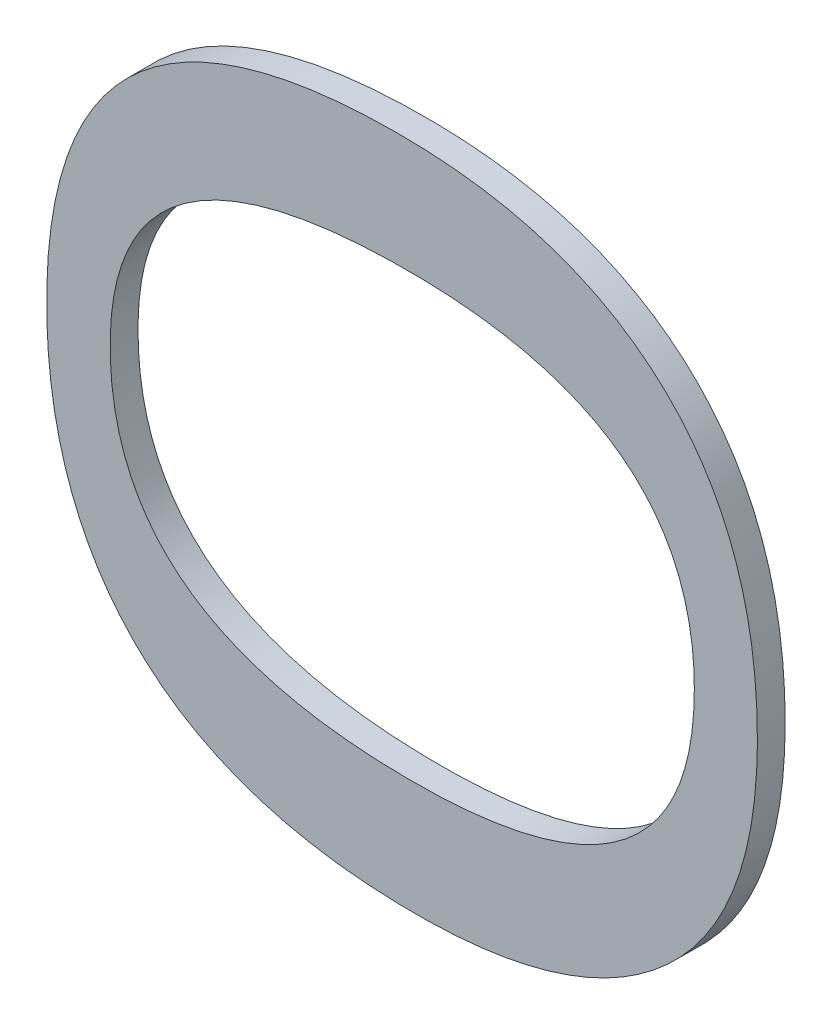
ISO-10303-21;
HEADER;
FILE_DESCRIPTION(('STEP AP214'),'2;1');
FILE_NAME('part.step','',(''),(''),'','','');
FILE_SCHEMA(('AUTOMOTIVE_DESIGN { 1 0 10303 214 1 1 1 1 }'));
ENDSEC;
DATA;
#1=APPLICATION_CONTEXT('core data for automotive mechanical design processes');
#2=APPLICATION_PROTOCOL_DEFINITION('international standard','automotive_design',2000,#1);
#3=PRODUCT_CONTEXT('',#1,'mechanical');
#4=PRODUCT('Part','Part','',(#3));
#5=PRODUCT_RELATED_PRODUCT_CATEGORY('part','',(#4));
#6=PRODUCT_DEFINITION_FORMATION('','',#4);
#7=PRODUCT_DEFINITION_CONTEXT('part definition',#1,'design');
#8=PRODUCT_DEFINITION('design','',#6,#7);
#9=PRODUCT_DEFINITION_SHAPE('','',#8);
#10=(LENGTH_UNIT() NAMED_UNIT(*) SI_UNIT(.MILLI.,.METRE.));
#11=(NAMED_UNIT(*) PLANE_ANGLE_UNIT() SI_UNIT($,.RADIAN.));
#12=(NAMED_UNIT(*) SI_UNIT($,.STERADIAN.) SOLID_ANGLE_UNIT());
#13=UNCERTAINTY_MEASURE_WITH_UNIT(LENGTH_MEASURE(1.E-05),#10,'distance_accuracy_value','');
#14=(GEOMETRIC_REPRESENTATION_CONTEXT(3) GLOBAL_UNCERTAINTY_ASSIGNED_CONTEXT((#13)) GLOBAL_UNIT_ASSIGNED_CONTEXT((#10,
#11,#12)) REPRESENTATION_CONTEXT('',''));
#15=CARTESIAN_POINT('',(0.,0.,0.));
#16=DIRECTION('',(0.,0.,1.));
#17=DIRECTION('',(1.,0.,0.));
#18=AXIS2_PLACEMENT_3D('',#15,#16,#17);
#19=CARTESIAN_POINT('',(-8.95983005625009,-22.7704584365744,333.160489148867));
#20=DIRECTION('',(0.,0.,1.));
#21=DIRECTION('',(1.,0.,0.));
#22=AXIS2_PLACEMENT_3D('',#19,#20,#21);
#23=PLANE('',#22);
#24=CARTESIAN_POINT('',(-6.29001147151449,26.5781048238699,333.160489148867));
#25=CARTESIAN_POINT('',(-6.29001147151449,25.4479212909212,333.160489148867));
#26=CARTESIAN_POINT('',(-6.61246499090257,24.585917457054,333.160489148867));
#27=CARTESIAN_POINT('',(-7.90227810007331,23.3982672179395,333.160489148867));
#28=CARTESIAN_POINT('',(-8.80738289127439,23.1013544707765,333.160489148867));
#29=CARTESIAN_POINT('',(-11.2816541006977,23.1013544707765,333.160489148867));
#30=CARTESIAN_POINT('',(-12.2729592930258,23.4210139904829,333.160489148867));
#31=CARTESIAN_POINT('',(-13.6202393380541,24.6996539374232,333.160489148867));
#32=CARTESIAN_POINT('',(-13.9570599991587,25.622716775464,333.160489148867));
#33=CARTESIAN_POINT('',(-13.9570599991587,29.1425672862814,333.160489148867));
#34=CARTESIAN_POINT('',(-12.6895943050247,30.2990895969785,333.160489148867));
#35=CARTESIAN_POINT('',(-8.92231678550516,30.2990895969785,333.160489148867));
#36=CARTESIAN_POINT('',(-7.97012099303567,29.9818240823448,333.160489148867));
#37=CARTESIAN_POINT('',(-6.62603373115335,28.7127622239139,333.160489148867));
#38=CARTESIAN_POINT('',(-6.29001147151449,27.7896993858731,333.160489148867));
#39=CARTESIAN_POINT('',(-6.29001147151449,26.5781048238699,333.160489148867));
#40=(BOUNDED_CURVE() B_SPLINE_CURVE(3,(#24,#25,#26,#27,#28,#29,#30,#31,#32,#33,#34,#35,#36,#37,
#38,#39),.UNSPECIFIED.,.T.,.F.) B_SPLINE_CURVE_WITH_KNOTS((4,2,2,2,2,2,2,4),(0.,
0.11774611816292,0.235492162392912,0.367754812889115,0.500017386090146,0.753520659801151,
0.876760304214654,1.),
.UNSPECIFIED.) CURVE() GEOMETRIC_REPRESENTATION_ITEM() RATIONAL_B_SPLINE_CURVE((1.,1.,1.,1.,1.,
1.,1.,1.,1.,1.,1.,1.,1.,1.,1.,1.)) REPRESENTATION_ITEM(''));
#41=CARTESIAN_POINT('',(-6.29001147151449,26.5781048238699,333.160489148867));
#42=VERTEX_POINT('',#41);
#43=EDGE_CURVE('E11',#42,#42,#40,.T.);
#44=ORIENTED_EDGE('',*,*,#43,.T.);
#45=EDGE_LOOP('',(#44));
#46=FACE_BOUND('',#45,.T.);
#47=CARTESIAN_POINT('',(-6.97003701237988,26.7074054291212,333.160489148867));
#48=CARTESIAN_POINT('',(-6.97003701237988,28.2829571615466,333.160489148867));
#49=CARTESIAN_POINT('',(-7.99965314819718,29.0707336023871,333.160489148867));
#50=CARTESIAN_POINT('',(-12.2011252545439,29.0707336023871,333.160489148867));
#51=CARTESIAN_POINT('',(-13.2722455460337,28.3021131847189,333.160489148867));
#52=CARTESIAN_POINT('',(-13.2722455460337,25.1366420875796,333.160489148867));
#53=CARTESIAN_POINT('',(-12.1867585177651,24.3225270969785,333.160489148867));
#54=CARTESIAN_POINT('',(-7.98528641141834,24.3225270969785,333.160489148867));
#55=CARTESIAN_POINT('',(-6.97003701237988,25.1174863450077,333.160489148867));
#56=CARTESIAN_POINT('',(-6.97003701237988,26.7074054291212,333.160489148867));
#57=(BOUNDED_CURVE() B_SPLINE_CURVE(3,(#47,#48,#49,#50,#51,#52,#53,#54,#55,#56),.UNSPECIFIED.,
.T.,.F.) B_SPLINE_CURVE_WITH_KNOTS((4,2,2,2,4),(0.,0.239648179665176,0.488956555898307,
0.753021542747821,1.),
.UNSPECIFIED.) CURVE() GEOMETRIC_REPRESENTATION_ITEM() RATIONAL_B_SPLINE_CURVE((1.,1.,1.,1.,1.,
1.,1.,1.,1.,1.)) REPRESENTATION_ITEM(''));
#58=CARTESIAN_POINT('',(-6.97003701237988,26.7074054291212,333.160489148867));
#59=VERTEX_POINT('',#58);
#60=EDGE_CURVE('E78',#59,#59,#57,.T.);
#61=ORIENTED_EDGE('',*,*,#60,.T.);
#62=EDGE_LOOP('',(#61));
#63=FACE_BOUND('',#62,.T.);
#64=ADVANCED_FACE('F42',(#46,#63),#23,.F.);
#65=CARTESIAN_POINT('',(-6.29001147151449,26.5781048238699,332.960489148867));
#66=CARTESIAN_POINT('',(-6.29001147151449,25.4479212909212,332.960489148867));
#67=CARTESIAN_POINT('',(-6.61246499090257,24.585917457054,332.960489148867));
#68=CARTESIAN_POINT('',(-7.90227810007331,23.3982672179395,332.960489148867));
#69=CARTESIAN_POINT('',(-8.80738289127439,23.1013544707765,332.960489148867));
#70=CARTESIAN_POINT('',(-11.2816541006977,23.1013544707765,332.960489148867));
#71=CARTESIAN_POINT('',(-12.2729592930258,23.4210139904829,332.960489148867));
#72=CARTESIAN_POINT('',(-13.6202393380541,24.6996539374232,332.960489148867));
#73=CARTESIAN_POINT('',(-13.9570599991587,25.622716775464,332.960489148867));
#74=CARTESIAN_POINT('',(-13.9570599991587,29.1425672862814,332.960489148867));
#75=CARTESIAN_POINT('',(-12.6895943050247,30.2990895969785,332.960489148867));
#76=CARTESIAN_POINT('',(-8.92231678550516,30.2990895969785,332.960489148867));
#77=CARTESIAN_POINT('',(-7.97012099303567,29.9818240823448,332.960489148867));
#78=CARTESIAN_POINT('',(-6.62603373115335,28.7127622239139,332.960489148867));
#79=CARTESIAN_POINT('',(-6.29001147151449,27.7896993858731,332.960489148867));
#80=CARTESIAN_POINT('',(-6.29001147151449,26.5781048238699,332.960489148867));
#81=(BOUNDED_CURVE() B_SPLINE_CURVE(3,(#65,#66,#67,#68,#69,#70,#71,#72,#73,#74,#75,#76,#77,#78,
#79,#80),.UNSPECIFIED.,.T.,.F.) B_SPLINE_CURVE_WITH_KNOTS((4,2,2,2,2,2,2,4),(0.,
0.11774611816292,0.235492162392912,0.367754812889115,0.500017386090146,0.753520659801151,
0.876760304214654,1.),
.UNSPECIFIED.) CURVE() GEOMETRIC_REPRESENTATION_ITEM() RATIONAL_B_SPLINE_CURVE((1.,1.,1.,1.,1.,
1.,1.,1.,1.,1.,1.,1.,1.,1.,1.,1.)) REPRESENTATION_ITEM(''));
#82=DIRECTION('',(0.,0.,1.));
#83=VECTOR('',#82,1.);
#84=SURFACE_OF_LINEAR_EXTRUSION('',#81,#83);
#85=ORIENTED_EDGE('',*,*,#43,.F.);
#86=EDGE_LOOP('',(#85));
#87=FACE_BOUND('',#86,.T.);
#88=CARTESIAN_POINT('',(-6.29001147151449,26.5781048238699,333.460489148867));
#89=CARTESIAN_POINT('',(-6.29001147151449,27.7896993858731,333.460489148867));
#90=CARTESIAN_POINT('',(-6.62603373115335,28.7127622239139,333.460489148867));
#91=CARTESIAN_POINT('',(-7.97012099303567,29.9818240823448,333.460489148867));
#92=CARTESIAN_POINT('',(-8.92231678550516,30.2990895969785,333.460489148867));
#93=CARTESIAN_POINT('',(-12.6895943050247,30.2990895969785,333.460489148867));
#94=CARTESIAN_POINT('',(-13.9570599991587,29.1425672862814,333.460489148867));
#95=CARTESIAN_POINT('',(-13.9570599991587,25.622716775464,333.460489148867));
#96=CARTESIAN_POINT('',(-13.6202393380541,24.6996539374232,333.460489148867));
#97=CARTESIAN_POINT('',(-12.2729592930258,23.4210139904829,333.460489148867));
#98=CARTESIAN_POINT('',(-11.2816541006977,23.1013544707765,333.460489148867));
#99=CARTESIAN_POINT('',(-8.80738289127439,23.1013544707765,333.460489148867));
#100=CARTESIAN_POINT('',(-7.90227810007331,23.3982672179395,333.460489148867));
#101=CARTESIAN_POINT('',(-6.61246499090257,24.585917457054,333.460489148867));
#102=CARTESIAN_POINT('',(-6.29001147151449,25.4479212909212,333.460489148867));
#103=CARTESIAN_POINT('',(-6.29001147151449,26.5781048238699,333.460489148867));
#104=(BOUNDED_CURVE() B_SPLINE_CURVE(3,(#88,#89,#90,#91,#92,#93,#94,#95,#96,#97,#98,#99,#100,
#101,#102,#103),.UNSPECIFIED.,.T.,.F.) B_SPLINE_CURVE_WITH_KNOTS((4,2,2,2,2,2,2,4),(0.,
0.123239695785346,0.246479340198849,0.499982613909854,0.632245187110885,0.764507837607088,
0.88225388183708,1.),
.UNSPECIFIED.) CURVE() GEOMETRIC_REPRESENTATION_ITEM() RATIONAL_B_SPLINE_CURVE((1.,1.,1.,1.,1.,
1.,1.,1.,1.,1.,1.,1.,1.,1.,1.,1.)) REPRESENTATION_ITEM(''));
#105=CARTESIAN_POINT('',(-6.29001147151449,26.5781048238699,333.460489148867));
#106=VERTEX_POINT('',#105);
#107=EDGE_CURVE('E55',#106,#106,#104,.T.);
#108=ORIENTED_EDGE('',*,*,#107,.F.);
#109=EDGE_LOOP('',(#108));
#110=FACE_BOUND('',#109,.T.);
#111=ADVANCED_FACE('F115',(#87,#110),#84,.F.);
#112=CARTESIAN_POINT('',(-13.9570599816985,26.82904674461,333.460489148867));
#113=DIRECTION('',(0.,0.,-1.));
#114=DIRECTION('',(0.,-1.,0.));
#115=AXIS2_PLACEMENT_3D('',#112,#113,#114);
#116=PLANE('',#115);
#117=ORIENTED_EDGE('',*,*,#107,.T.);
#118=EDGE_LOOP('',(#117));
#119=FACE_BOUND('',#118,.T.);
#120=CARTESIAN_POINT('',(-6.97003701237988,26.7074054291212,333.460489148867));
#121=CARTESIAN_POINT('',(-6.97003701237988,25.1174863450077,333.460489148867));
#122=CARTESIAN_POINT('',(-7.98528641141834,24.3225270969785,333.460489148867));
#123=CARTESIAN_POINT('',(-12.1867585177651,24.3225270969785,333.460489148867));
#124=CARTESIAN_POINT('',(-13.2722455460337,25.1366420875796,333.460489148867));
#125=CARTESIAN_POINT('',(-13.2722455460337,28.3021131847189,333.460489148867));
#126=CARTESIAN_POINT('',(-12.2011252545439,29.0707336023871,333.460489148867));
#127=CARTESIAN_POINT('',(-7.99965314819718,29.0707336023871,333.460489148867));
#128=CARTESIAN_POINT('',(-6.97003701237988,28.2829571615466,333.460489148867));
#129=CARTESIAN_POINT('',(-6.97003701237988,26.7074054291212,333.460489148867));
#130=(BOUNDED_CURVE() B_SPLINE_CURVE(3,(#120,#121,#122,#123,#124,#125,#126,#127,#128,#129),
.UNSPECIFIED.,.T.,.F.) B_SPLINE_CURVE_WITH_KNOTS((4,2,2,2,4),(0.,0.246978457252179,
0.511043444101693,0.760351820334824,1.),
.UNSPECIFIED.) CURVE() GEOMETRIC_REPRESENTATION_ITEM() RATIONAL_B_SPLINE_CURVE((1.,1.,1.,1.,1.,
1.,1.,1.,1.,1.)) REPRESENTATION_ITEM(''));
#131=CARTESIAN_POINT('',(-6.97003701237988,26.7074054291212,333.460489148867));
#132=VERTEX_POINT('',#131);
#133=EDGE_CURVE('E72',#132,#132,#130,.T.);
#134=ORIENTED_EDGE('',*,*,#133,.T.);
#135=EDGE_LOOP('',(#134));
#136=FACE_BOUND('',#135,.T.);
#137=ADVANCED_FACE('F118',(#119,#136),#116,.F.);
#138=CARTESIAN_POINT('',(-6.97003701237988,26.7074054291212,332.960489148867));
#139=CARTESIAN_POINT('',(-6.97003701237988,28.2829571615466,332.960489148867));
#140=CARTESIAN_POINT('',(-7.99965314819718,29.0707336023871,332.960489148867));
#141=CARTESIAN_POINT('',(-12.2011252545439,29.0707336023871,332.960489148867));
#142=CARTESIAN_POINT('',(-13.2722455460337,28.3021131847189,332.960489148867));
#143=CARTESIAN_POINT('',(-13.2722455460337,25.1366420875796,332.960489148867));
#144=CARTESIAN_POINT('',(-12.1867585177651,24.3225270969785,332.960489148867));
#145=CARTESIAN_POINT('',(-7.98528641141834,24.3225270969785,332.960489148867));
#146=CARTESIAN_POINT('',(-6.97003701237988,25.1174863450077,332.960489148867));
#147=CARTESIAN_POINT('',(-6.97003701237988,26.7074054291212,332.960489148867));
#148=(BOUNDED_CURVE() B_SPLINE_CURVE(3,(#138,#139,#140,#141,#142,#143,#144,#145,#146,#147),
.UNSPECIFIED.,.T.,.F.) B_SPLINE_CURVE_WITH_KNOTS((4,2,2,2,4),(0.,0.239648179665176,
0.488956555898307,0.753021542747821,1.),
.UNSPECIFIED.) CURVE() GEOMETRIC_REPRESENTATION_ITEM() RATIONAL_B_SPLINE_CURVE((1.,1.,1.,1.,1.,
1.,1.,1.,1.,1.)) REPRESENTATION_ITEM(''));
#149=DIRECTION('',(0.,0.,1.));
#150=VECTOR('',#149,1.);
#151=SURFACE_OF_LINEAR_EXTRUSION('',#148,#150);
#152=ORIENTED_EDGE('',*,*,#60,.F.);
#153=EDGE_LOOP('',(#152));
#154=FACE_BOUND('',#153,.T.);
#155=ORIENTED_EDGE('',*,*,#133,.F.);
#156=EDGE_LOOP('',(#155));
#157=FACE_BOUND('',#156,.T.);
#158=ADVANCED_FACE('F44',(#154,#157),#151,.F.);
#159=CLOSED_SHELL('',(#64,#111,#137,#158));
#160=MANIFOLD_SOLID_BREP('B2',#159);
#161=ADVANCED_BREP_SHAPE_REPRESENTATION('',(#18,#160),#14);
#162=SHAPE_DEFINITION_REPRESENTATION(#9,#161);
ENDSEC;
END-ISO-10303-21;
